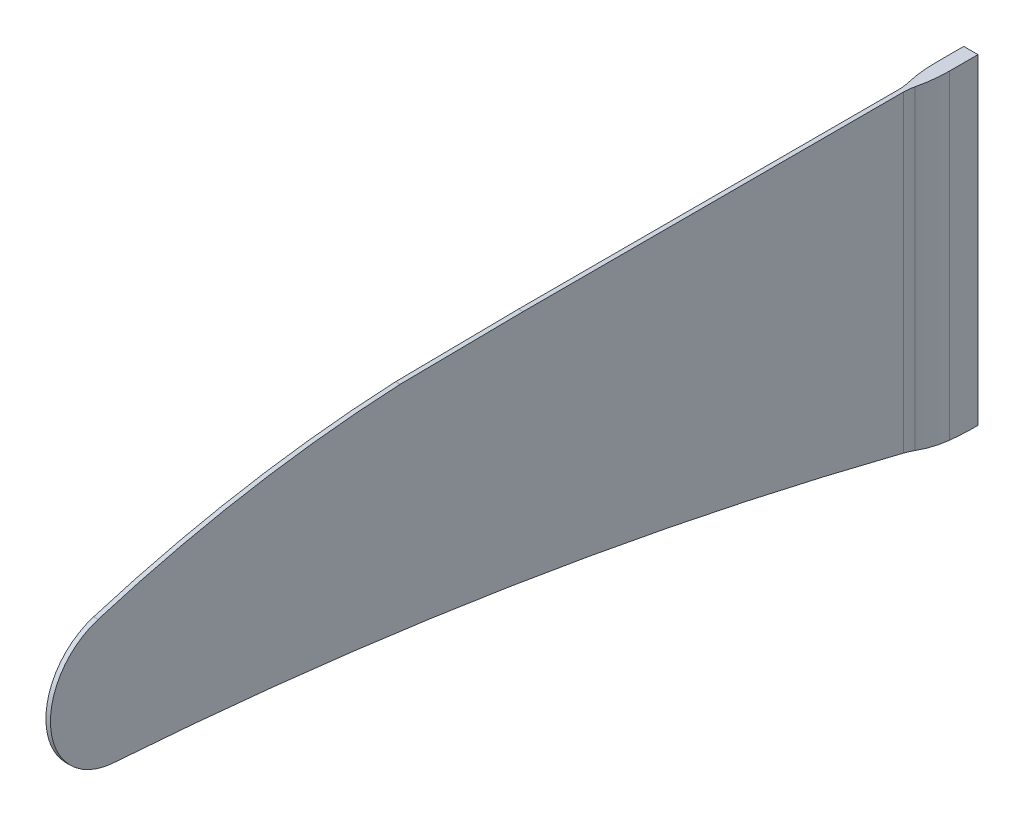
ISO-10303-21;
HEADER;
FILE_DESCRIPTION(('STEP AP214'),'2;1');
FILE_NAME('part.step','',(''),(''),'','','');
FILE_SCHEMA(('AUTOMOTIVE_DESIGN { 1 0 10303 214 1 1 1 1 }'));
ENDSEC;
DATA;
#1=APPLICATION_CONTEXT('core data for automotive mechanical design processes');
#2=APPLICATION_PROTOCOL_DEFINITION('international standard','automotive_design',2000,#1);
#3=PRODUCT_CONTEXT('',#1,'mechanical');
#4=PRODUCT('Part','Part','',(#3));
#5=PRODUCT_RELATED_PRODUCT_CATEGORY('part','',(#4));
#6=PRODUCT_DEFINITION_FORMATION('','',#4);
#7=PRODUCT_DEFINITION_CONTEXT('part definition',#1,'design');
#8=PRODUCT_DEFINITION('design','',#6,#7);
#9=PRODUCT_DEFINITION_SHAPE('','',#8);
#10=(LENGTH_UNIT() NAMED_UNIT(*) SI_UNIT(.MILLI.,.METRE.));
#11=(NAMED_UNIT(*) PLANE_ANGLE_UNIT() SI_UNIT($,.RADIAN.));
#12=(NAMED_UNIT(*) SI_UNIT($,.STERADIAN.) SOLID_ANGLE_UNIT());
#13=UNCERTAINTY_MEASURE_WITH_UNIT(LENGTH_MEASURE(1.E-05),#10,'distance_accuracy_value','');
#14=(GEOMETRIC_REPRESENTATION_CONTEXT(3) GLOBAL_UNCERTAINTY_ASSIGNED_CONTEXT((#13)) GLOBAL_UNIT_ASSIGNED_CONTEXT((#10,
#11,#12)) REPRESENTATION_CONTEXT('',''));
#15=CARTESIAN_POINT('',(0.,0.,0.));
#16=DIRECTION('',(0.,0.,1.));
#17=DIRECTION('',(1.,0.,0.));
#18=AXIS2_PLACEMENT_3D('',#15,#16,#17);
#19=CARTESIAN_POINT('',(-1.57992226031378,72.55,500.));
#20=DIRECTION('',(1.,0.,0.));
#21=DIRECTION('',(0.,1.,0.));
#22=AXIS2_PLACEMENT_3D('',#19,#20,#21);
#23=PLANE('',#22);
#24=CARTESIAN_POINT('',(-1.57992226031378,66.2,0.));
#25=DIRECTION('',(1.,0.,0.));
#26=DIRECTION('',(0.,1.,0.));
#27=AXIS2_PLACEMENT_3D('',#24,#25,#26);
#28=CIRCLE('',#27,65.);
#29=CARTESIAN_POINT('',(-1.57992226031377,1.50489211757772,6.28832378951223));
#30=VERTEX_POINT('',#29);
#31=CARTESIAN_POINT('',(-1.57992226031378,1.19999999999995,0.));
#32=VERTEX_POINT('',#31);
#33=EDGE_CURVE('E260',#30,#32,#28,.T.);
#34=ORIENTED_EDGE('',*,*,#33,.F.);
#35=DIRECTION('',(0.,-1.,0.));
#36=VECTOR('',#35,1.);
#37=CARTESIAN_POINT('',(-1.57992226031378,72.55,6.28832378951222));
#38=LINE('',#37,#36);
#39=CARTESIAN_POINT('',(-1.57992226031378,72.55,6.28832378951222));
#40=VERTEX_POINT('',#39);
#41=EDGE_CURVE('E13',#30,#40,#38,.F.);
#42=ORIENTED_EDGE('',*,*,#41,.T.);
#43=DIRECTION('',(0.,0.,-1.));
#44=VECTOR('',#43,1.);
#45=CARTESIAN_POINT('',(-1.57992226031378,72.55,500.));
#46=LINE('',#45,#44);
#47=CARTESIAN_POINT('',(-1.57992226031378,72.55,0.));
#48=VERTEX_POINT('',#47);
#49=EDGE_CURVE('E365',#40,#48,#46,.T.);
#50=ORIENTED_EDGE('',*,*,#49,.T.);
#51=DIRECTION('',(0.,-1.,0.));
#52=VECTOR('',#51,1.);
#53=CARTESIAN_POINT('',(-1.57992226031378,72.55,0.));
#54=LINE('',#53,#52);
#55=EDGE_CURVE('E264',#48,#32,#54,.T.);
#56=ORIENTED_EDGE('',*,*,#55,.T.);
#57=EDGE_LOOP('',(#34,#42,#50,#56));
#58=FACE_BOUND('',#57,.T.);
#59=ADVANCED_FACE('F105',(#58),#23,.F.);
#60=CARTESIAN_POINT('',(1.57992226031358,1.19999999999996,500.));
#61=DIRECTION('',(-1.,0.,0.));
#62=DIRECTION('',(0.,-1.,0.));
#63=AXIS2_PLACEMENT_3D('',#60,#61,#62);
#64=PLANE('',#63);
#65=DIRECTION('',(0.,0.,-1.));
#66=VECTOR('',#65,1.);
#67=CARTESIAN_POINT('',(1.57992226031357,72.55,500.));
#68=LINE('',#67,#66);
#69=CARTESIAN_POINT('',(1.57992226031357,72.55,6.28832378951311));
#70=VERTEX_POINT('',#69);
#71=CARTESIAN_POINT('',(1.57992226031357,72.55,0.));
#72=VERTEX_POINT('',#71);
#73=EDGE_CURVE('E366',#70,#72,#68,.T.);
#74=ORIENTED_EDGE('',*,*,#73,.F.);
#75=DIRECTION('',(0.,-1.,0.));
#76=VECTOR('',#75,1.);
#77=CARTESIAN_POINT('',(1.57992226031358,1.19999999999996,6.28832378951311));
#78=LINE('',#77,#76);
#79=CARTESIAN_POINT('',(1.57992226031358,1.5048921175778,6.28832378951311));
#80=VERTEX_POINT('',#79);
#81=EDGE_CURVE('E277',#70,#80,#78,.T.);
#82=ORIENTED_EDGE('',*,*,#81,.T.);
#83=CARTESIAN_POINT('',(1.57992226031357,66.2,0.));
#84=DIRECTION('',(-1.,0.,0.));
#85=DIRECTION('',(0.,-1.,0.));
#86=AXIS2_PLACEMENT_3D('',#83,#84,#85);
#87=CIRCLE('',#86,65.);
#88=CARTESIAN_POINT('',(1.57992226031357,1.19999999999995,0.));
#89=VERTEX_POINT('',#88);
#90=EDGE_CURVE('E254',#89,#80,#87,.T.);
#91=ORIENTED_EDGE('',*,*,#90,.F.);
#92=DIRECTION('',(0.,1.,0.));
#93=VECTOR('',#92,1.);
#94=CARTESIAN_POINT('',(1.57992226031358,1.19999999999996,0.));
#95=LINE('',#94,#93);
#96=EDGE_CURVE('E367',#89,#72,#95,.T.);
#97=ORIENTED_EDGE('',*,*,#96,.T.);
#98=EDGE_LOOP('',(#74,#82,#91,#97));
#99=FACE_BOUND('',#98,.T.);
#100=ADVANCED_FACE('F344',(#99),#64,.F.);
#101=CARTESIAN_POINT('',(-1.57993426031378,73.7171966231066,0.867958143014099));
#102=DIRECTION('',(0.,-0.999930691772244,-0.011773344974182));
#103=DIRECTION('',(0.,0.011773344974182,-0.999930691772244));
#104=AXIS2_PLACEMENT_3D('',#101,#102,#103);
#105=PLANE('',#104);
#106=DIRECTION('',(-1.,0.,0.));
#107=VECTOR('',#106,1.);
#108=CARTESIAN_POINT('',(8.42007773968622,72.55,100.));
#109=LINE('',#108,#107);
#110=CARTESIAN_POINT('',(0.499999999999989,72.55,100.));
#111=VERTEX_POINT('',#110);
#112=CARTESIAN_POINT('',(-0.499999999999987,72.55,100.));
#113=VERTEX_POINT('',#112);
#114=EDGE_CURVE('E225',#111,#113,#109,.T.);
#115=ORIENTED_EDGE('',*,*,#114,.T.);
#116=DIRECTION('',(0.,-0.011773344974182,0.999930691772244));
#117=VECTOR('',#116,1.);
#118=CARTESIAN_POINT('',(-0.500000000000001,73.7171966231066,0.867958143014099));
#119=LINE('',#118,#117);
#120=CARTESIAN_POINT('',(-0.499999999999985,72.2283959789141,127.31438957971));
#121=VERTEX_POINT('',#120);
#122=EDGE_CURVE('E228',#113,#121,#119,.T.);
#123=ORIENTED_EDGE('',*,*,#122,.T.);
#124=DIRECTION('',(1.,0.,0.));
#125=VECTOR('',#124,1.);
#126=CARTESIAN_POINT('',(-1.5800452603138,72.2283959789142,127.31438957971));
#127=LINE('',#126,#125);
#128=CARTESIAN_POINT('',(0.499999999999952,72.2283959789142,127.31438957971));
#129=VERTEX_POINT('',#128);
#130=EDGE_CURVE('E371',#129,#121,#127,.F.);
#131=ORIENTED_EDGE('',*,*,#130,.F.);
#132=DIRECTION('',(0.,0.011773344974182,-0.999930691772244));
#133=VECTOR('',#132,1.);
#134=CARTESIAN_POINT('',(0.5,73.7171966231066,0.8679581430141));
#135=LINE('',#134,#133);
#136=EDGE_CURVE('E230',#129,#111,#135,.T.);
#137=ORIENTED_EDGE('',*,*,#136,.T.);
#138=EDGE_LOOP('',(#115,#123,#131,#137));
#139=FACE_BOUND('',#138,.T.);
#140=ADVANCED_FACE('F301',(#139),#105,.F.);
#141=CARTESIAN_POINT('',(0.,0.,0.));
#142=DIRECTION('',(0.,0.,1.));
#143=DIRECTION('',(1.,0.,0.));
#144=AXIS2_PLACEMENT_3D('',#141,#142,#143);
#145=PLANE('',#144);
#146=DIRECTION('',(1.,0.,0.));
#147=VECTOR('',#146,1.);
#148=CARTESIAN_POINT('',(-1.57997726031378,72.55,0.));
#149=LINE('',#148,#147);
#150=EDGE_CURVE('E245',#48,#72,#149,.T.);
#151=ORIENTED_EDGE('',*,*,#150,.T.);
#152=ORIENTED_EDGE('',*,*,#96,.F.);
#153=DIRECTION('',(1.,0.,0.));
#154=VECTOR('',#153,1.);
#155=CARTESIAN_POINT('',(-1.57997726031378,1.19999999999995,0.));
#156=LINE('',#155,#154);
#157=EDGE_CURVE('E244',#32,#89,#156,.T.);
#158=ORIENTED_EDGE('',*,*,#157,.F.);
#159=ORIENTED_EDGE('',*,*,#55,.F.);
#160=EDGE_LOOP('',(#151,#152,#158,#159));
#161=FACE_BOUND('',#160,.T.);
#162=ADVANCED_FACE('F340',(#161),#145,.F.);
#163=CARTESIAN_POINT('',(1.57992226031357,72.55,500.));
#164=DIRECTION('',(0.,-1.,0.));
#165=DIRECTION('',(0.,0.,-1.));
#166=AXIS2_PLACEMENT_3D('',#163,#164,#165);
#167=PLANE('',#166);
#168=CARTESIAN_POINT('',(10.5,72.55,15.5202005616957));
#169=DIRECTION('',(0.,-1.,0.));
#170=DIRECTION('',(0.,0.,-1.));
#171=AXIS2_PLACEMENT_3D('',#168,#169,#170);
#172=CIRCLE('',#171,10.);
#173=CARTESIAN_POINT('',(0.499999999999999,72.55,15.5202005616957));
#174=VERTEX_POINT('',#173);
#175=CARTESIAN_POINT('',(0.769980565078392,72.55,13.2122313686501));
#176=VERTEX_POINT('',#175);
#177=EDGE_CURVE('E200',#174,#176,#172,.T.);
#178=ORIENTED_EDGE('',*,*,#177,.T.);
#179=CARTESIAN_POINT('',(-28.4200777396864,72.55,6.28832378951311));
#180=DIRECTION('',(0.,-1.,0.));
#181=DIRECTION('',(0.,0.,-1.));
#182=AXIS2_PLACEMENT_3D('',#179,#180,#181);
#183=CIRCLE('',#182,30.);
#184=EDGE_CURVE('E359',#176,#70,#183,.F.);
#185=ORIENTED_EDGE('',*,*,#184,.T.);
#186=ORIENTED_EDGE('',*,*,#73,.T.);
#187=ORIENTED_EDGE('',*,*,#150,.F.);
#188=ORIENTED_EDGE('',*,*,#49,.F.);
#189=CARTESIAN_POINT('',(28.4200777396862,72.55,6.28832378951223));
#190=DIRECTION('',(0.,-1.,0.));
#191=DIRECTION('',(0.,0.,-1.));
#192=AXIS2_PLACEMENT_3D('',#189,#190,#191);
#193=CIRCLE('',#192,30.);
#194=CARTESIAN_POINT('',(-0.769980565078444,72.55,13.2122313686499));
#195=VERTEX_POINT('',#194);
#196=EDGE_CURVE('E121',#40,#195,#193,.F.);
#197=ORIENTED_EDGE('',*,*,#196,.T.);
#198=CARTESIAN_POINT('',(-10.5,72.55,15.5202005616957));
#199=DIRECTION('',(0.,-1.,0.));
#200=DIRECTION('',(0.,0.,-1.));
#201=AXIS2_PLACEMENT_3D('',#198,#199,#200);
#202=CIRCLE('',#201,10.);
#203=CARTESIAN_POINT('',(-0.499999999999999,72.55,15.5202005616957));
#204=VERTEX_POINT('',#203);
#205=EDGE_CURVE('E210',#195,#204,#202,.T.);
#206=ORIENTED_EDGE('',*,*,#205,.T.);
#207=DIRECTION('',(0.,0.,1.));
#208=VECTOR('',#207,1.);
#209=CARTESIAN_POINT('',(-0.499999999999938,72.55,500.));
#210=LINE('',#209,#208);
#211=EDGE_CURVE('E236',#204,#113,#210,.T.);
#212=ORIENTED_EDGE('',*,*,#211,.T.);
#213=ORIENTED_EDGE('',*,*,#114,.F.);
#214=DIRECTION('',(0.,0.,-1.));
#215=VECTOR('',#214,1.);
#216=CARTESIAN_POINT('',(0.499999999999938,72.55,500.));
#217=LINE('',#216,#215);
#218=EDGE_CURVE('E215',#111,#174,#217,.T.);
#219=ORIENTED_EDGE('',*,*,#218,.T.);
#220=EDGE_LOOP('',(#178,#185,#186,#187,#188,#197,#206,#212,#213,#219));
#221=FACE_BOUND('',#220,.T.);
#222=ADVANCED_FACE('F222',(#221),#167,.F.);
#223=CARTESIAN_POINT('',(-1.58004526031377,46.1999999999999,190.));
#224=DIRECTION('',(1.,0.,0.));
#225=DIRECTION('',(0.,0.,-1.));
#226=AXIS2_PLACEMENT_3D('',#223,#224,#225);
#227=CYLINDRICAL_SURFACE('',#226,15.);
#228=CARTESIAN_POINT('',(-0.499999999999977,46.1999999999999,190.));
#229=DIRECTION('',(1.,0.,0.));
#230=DIRECTION('',(0.,0.,-1.));
#231=AXIS2_PLACEMENT_3D('',#228,#229,#230);
#232=CIRCLE('',#231,15.);
#233=CARTESIAN_POINT('',(-0.499999999999977,31.2367967574166,191.050023200288));
#234=VERTEX_POINT('',#233);
#235=CARTESIAN_POINT('',(-0.500000000000021,60.5451923076923,194.383543960693));
#236=VERTEX_POINT('',#235);
#237=EDGE_CURVE('E234',#234,#236,#232,.F.);
#238=ORIENTED_EDGE('',*,*,#237,.F.);
#239=DIRECTION('',(1.,0.,0.));
#240=VECTOR('',#239,1.);
#241=CARTESIAN_POINT('',(-1.58004526031377,31.2367967574166,191.050023200288));
#242=LINE('',#241,#240);
#243=CARTESIAN_POINT('',(0.499999999999976,31.2367967574166,191.050023200288));
#244=VERTEX_POINT('',#243);
#245=EDGE_CURVE('E255',#234,#244,#242,.T.);
#246=ORIENTED_EDGE('',*,*,#245,.T.);
#247=CARTESIAN_POINT('',(0.499999999999977,46.1999999999999,190.));
#248=DIRECTION('',(-1.,0.,0.));
#249=DIRECTION('',(0.,0.,1.));
#250=AXIS2_PLACEMENT_3D('',#247,#248,#249);
#251=CIRCLE('',#250,15.);
#252=CARTESIAN_POINT('',(0.499999999999976,60.5451923076923,194.383543960693));
#253=VERTEX_POINT('',#252);
#254=EDGE_CURVE('E390',#253,#244,#251,.F.);
#255=ORIENTED_EDGE('',*,*,#254,.F.);
#256=DIRECTION('',(1.,0.,0.));
#257=VECTOR('',#256,1.);
#258=CARTESIAN_POINT('',(-1.58004526031377,60.5451923076923,194.383543960693));
#259=LINE('',#258,#257);
#260=EDGE_CURVE('E251',#236,#253,#259,.T.);
#261=ORIENTED_EDGE('',*,*,#260,.F.);
#262=EDGE_LOOP('',(#238,#246,#255,#261));
#263=FACE_BOUND('',#262,.T.);
#264=ADVANCED_FACE('F331',(#263),#227,.T.);
#265=CARTESIAN_POINT('',(-1.58004526031377,-966.310086081473,261.051569886161));
#266=DIRECTION('',(1.,0.,0.));
#267=DIRECTION('',(0.,0.,-1.));
#268=AXIS2_PLACEMENT_3D('',#265,#266,#267);
#269=CYLINDRICAL_SURFACE('',#268,1000.);
#270=CARTESIAN_POINT('',(-0.499999999999968,-966.310086081473,261.051569886161));
#271=DIRECTION('',(1.,0.,0.));
#272=DIRECTION('',(0.,0.,-1.));
#273=AXIS2_PLACEMENT_3D('',#270,#271,#272);
#274=CIRCLE('',#273,1000.);
#275=CARTESIAN_POINT('',(-0.499999999999999,3.18295249268008,15.9327249226296));
#276=VERTEX_POINT('',#275);
#277=EDGE_CURVE('E240',#276,#234,#274,.T.);
#278=ORIENTED_EDGE('',*,*,#277,.F.);
#279=DIRECTION('',(1.,0.,0.));
#280=VECTOR('',#279,1.);
#281=CARTESIAN_POINT('',(-1.58004526031377,3.18295249268008,15.9327249226296));
#282=LINE('',#281,#280);
#283=CARTESIAN_POINT('',(0.499999999999999,3.18295249268008,15.9327249226296));
#284=VERTEX_POINT('',#283);
#285=EDGE_CURVE('E248',#276,#284,#282,.T.);
#286=ORIENTED_EDGE('',*,*,#285,.T.);
#287=CARTESIAN_POINT('',(0.499999999999968,-966.310086081473,261.051569886161));
#288=DIRECTION('',(-1.,0.,0.));
#289=DIRECTION('',(0.,0.,1.));
#290=AXIS2_PLACEMENT_3D('',#287,#288,#289);
#291=CIRCLE('',#290,1000.);
#292=EDGE_CURVE('E226',#244,#284,#291,.T.);
#293=ORIENTED_EDGE('',*,*,#292,.F.);
#294=ORIENTED_EDGE('',*,*,#245,.F.);
#295=EDGE_LOOP('',(#278,#286,#293,#294));
#296=FACE_BOUND('',#295,.T.);
#297=ADVANCED_FACE('F298',(#296),#269,.F.);
#298=CARTESIAN_POINT('',(-1.58004526031377,66.2,0.));
#299=DIRECTION('',(1.,0.,0.));
#300=DIRECTION('',(0.,0.,-1.));
#301=AXIS2_PLACEMENT_3D('',#298,#299,#300);
#302=CYLINDRICAL_SURFACE('',#301,65.);
#303=ORIENTED_EDGE('',*,*,#90,.T.);
#304=CARTESIAN_POINT('',(1.57992226031358,1.5048921175778,6.28832378951311));
#305=CARTESIAN_POINT('',(1.579955820108,1.56195870539984,6.87581847035463));
#306=CARTESIAN_POINT('',(1.56266547493592,1.62709912069166,7.4624997395882));
#307=CARTESIAN_POINT('',(1.49410411293245,1.77272853727736,8.6295961738389));
#308=CARTESIAN_POINT('',(1.44296788851709,1.85315575627997,9.21002695052434));
#309=CARTESIAN_POINT('',(1.30737500635404,2.02901756217777,10.3646563176555));
#310=CARTESIAN_POINT('',(1.22291921118261,2.12445176053417,10.9388550690403));
#311=CARTESIAN_POINT('',(1.02105966576886,2.32994893214962,12.0812151188718));
#312=CARTESIAN_POINT('',(0.903526297159662,2.44006854029402,12.6493433507696));
#313=CARTESIAN_POINT('',(0.769980565078394,2.55695684317679,13.2122313686501));
#314=B_SPLINE_CURVE_WITH_KNOTS('',3,(#304,#305,#306,#307,#308,#309,#310,#311,#312,#313),
.UNSPECIFIED.,.F.,.F.,(4,2,2,2,4),(0.,1.77042852175315,3.53384833557092,5.29722250101437,
7.06760524286698),.UNSPECIFIED.);
#315=CARTESIAN_POINT('',(0.769980565078393,2.5569568431768,13.2122313686501));
#316=VERTEX_POINT('',#315);
#317=EDGE_CURVE('E286',#80,#316,#314,.T.);
#318=ORIENTED_EDGE('',*,*,#317,.T.);
#319=CARTESIAN_POINT('',(0.499999999999999,3.08008733747532,15.5202005616957));
#320=CARTESIAN_POINT('',(0.499968696624079,3.0108081845514,15.2385272506194));
#321=CARTESIAN_POINT('',(0.51190002558859,2.94344668579803,14.9563605380322));
#322=CARTESIAN_POINT('',(0.559725351376096,2.81288130621248,14.3929212172539));
#323=CARTESIAN_POINT('',(0.595633686466034,2.74967993800012,14.1116492453024));
#324=CARTESIAN_POINT('',(0.690518461012125,2.62902612971122,13.557664287522));
#325=CARTESIAN_POINT('',(0.74903251434491,2.57148576510136,13.2848912477057));
#326=CARTESIAN_POINT('',(0.888905345430147,2.46104388131463,12.7444670966546));
#327=CARTESIAN_POINT('',(0.970250396487631,2.40813959978528,12.4768130107128));
#328=CARTESIAN_POINT('',(1.13511044664755,2.31815727781069,12.0064262006707));
#329=CARTESIAN_POINT('',(1.21424161999438,2.28015203673724,11.8023226495791));
#330=CARTESIAN_POINT('',(1.38659319670949,2.20676592685611,11.3977516823288));
#331=CARTESIAN_POINT('',(1.47991771774305,2.17140759945188,11.1973245356179));
#332=CARTESIAN_POINT('',(1.57992226031357,2.13753048781218,11.0000000000004));
#333=B_SPLINE_CURVE_WITH_KNOTS('',3,(#319,#320,#321,#322,#323,#324,#325,#326,#327,#328,#329,
#330,#331,#332),.UNSPECIFIED.,.F.,.F.,(4,2,2,2,2,2,4),(0.,0.869986112528973,1.74049294386196,
2.59406388848903,3.44712273542541,4.11319888358215,4.78442049926306),.UNSPECIFIED.);
#334=CARTESIAN_POINT('',(0.499999999999999,3.08008733747532,15.5202005616957));
#335=VERTEX_POINT('',#334);
#336=EDGE_CURVE('E305',#335,#316,#333,.T.);
#337=ORIENTED_EDGE('',*,*,#336,.F.);
#338=CARTESIAN_POINT('',(0.500000000000001,66.2,0.));
#339=DIRECTION('',(-1.,0.,0.));
#340=DIRECTION('',(0.,0.,1.));
#341=AXIS2_PLACEMENT_3D('',#338,#339,#340);
#342=CIRCLE('',#341,65.);
#343=EDGE_CURVE('E218',#284,#335,#342,.F.);
#344=ORIENTED_EDGE('',*,*,#343,.F.);
#345=ORIENTED_EDGE('',*,*,#285,.F.);
#346=CARTESIAN_POINT('',(-0.500000000000001,66.2,0.));
#347=DIRECTION('',(1.,0.,0.));
#348=DIRECTION('',(0.,0.,-1.));
#349=AXIS2_PLACEMENT_3D('',#346,#347,#348);
#350=CIRCLE('',#349,65.);
#351=CARTESIAN_POINT('',(-0.499999999999999,3.08008733747532,15.5202005616957));
#352=VERTEX_POINT('',#351);
#353=EDGE_CURVE('E211',#352,#276,#350,.F.);
#354=ORIENTED_EDGE('',*,*,#353,.F.);
#355=CARTESIAN_POINT('',(-1.57992226031378,2.13753048781211,11.));
#356=CARTESIAN_POINT('',(-1.45026845968053,2.18143208581599,11.2557738230711));
#357=CARTESIAN_POINT('',(-1.33186250178587,2.22784474708297,11.5167991698455));
#358=CARTESIAN_POINT('',(-1.11807278096911,2.32563298800145,12.0472994659038));
#359=CARTESIAN_POINT('',(-1.02269505866946,2.377009864897,12.3167766113105));
#360=CARTESIAN_POINT('',(-0.857157643663026,2.483613359274,12.8567689082294));
#361=CARTESIAN_POINT('',(-0.786549887336367,2.53874738200388,13.1271652977404));
#362=CARTESIAN_POINT('',(-0.668352524846537,2.65350302244342,13.6718727988487));
#363=CARTESIAN_POINT('',(-0.620751591303848,2.71312241504286,13.9461819153891));
#364=CARTESIAN_POINT('',(-0.55653116466148,2.82305957718498,14.4364801541805));
#365=CARTESIAN_POINT('',(-0.535408427168862,2.87255284168283,14.6520772901228));
#366=CARTESIAN_POINT('',(-0.507085344548715,2.97433513961586,15.0852703426332));
#367=CARTESIAN_POINT('',(-0.499992430627914,3.02664261964927,15.3028689608882));
#368=CARTESIAN_POINT('',(-0.499999999999997,3.08008733747532,15.5202005616957));
#369=B_SPLINE_CURVE_WITH_KNOTS('',3,(#355,#356,#357,#358,#359,#360,#361,#362,#363,#364,#365,
#366,#367,#368),.UNSPECIFIED.,.F.,.F.,(4,2,2,2,2,2,4),(0.,0.870003919245588,1.74023580512752,
2.59379808902149,3.44693969344527,4.11313398626268,4.78441010932533),.UNSPECIFIED.);
#370=CARTESIAN_POINT('',(-0.769980565078444,2.55695684317674,13.2122313686499));
#371=VERTEX_POINT('',#370);
#372=EDGE_CURVE('E269',#371,#352,#369,.T.);
#373=ORIENTED_EDGE('',*,*,#372,.F.);
#374=CARTESIAN_POINT('',(-0.769980565078445,2.55695684317674,13.2122313686499));
#375=CARTESIAN_POINT('',(-0.903526297159739,2.44006854029396,12.6493433507694));
#376=CARTESIAN_POINT('',(-1.02105966576896,2.32994893214955,12.0812151188715));
#377=CARTESIAN_POINT('',(-1.22291921118274,2.1244517605341,10.9388550690399));
#378=CARTESIAN_POINT('',(-1.3073750063542,2.0290175621777,10.364656317655));
#379=CARTESIAN_POINT('',(-1.44296788851726,1.85315575627989,9.21002695052375));
#380=CARTESIAN_POINT('',(-1.49410411293263,1.77272853727727,8.62959617383825));
#381=CARTESIAN_POINT('',(-1.56266547493612,1.62709912069157,7.46249973958743));
#382=CARTESIAN_POINT('',(-1.5799558201082,1.56195870539976,6.87581847035381));
#383=CARTESIAN_POINT('',(-1.57992226031378,1.50489211757772,6.28832378951223));
#384=B_SPLINE_CURVE_WITH_KNOTS('',3,(#374,#375,#376,#377,#378,#379,#380,#381,#382,#383),
.UNSPECIFIED.,.F.,.F.,(4,2,2,2,4),(0.,1.77038274185277,3.5337569072964,5.29717672111434,
7.06760524286765),.UNSPECIFIED.);
#385=EDGE_CURVE('E280',#371,#30,#384,.T.);
#386=ORIENTED_EDGE('',*,*,#385,.T.);
#387=ORIENTED_EDGE('',*,*,#33,.T.);
#388=ORIENTED_EDGE('',*,*,#157,.T.);
#389=EDGE_LOOP('',(#303,#318,#337,#344,#345,#354,#373,#386,#387,#388));
#390=FACE_BOUND('',#389,.T.);
#391=ADVANCED_FACE('F292',(#390),#302,.T.);
#392=CARTESIAN_POINT('',(-1.58004526031377,-202.45,114.018571347993));
#393=DIRECTION('',(1.,0.,0.));
#394=DIRECTION('',(0.,0.,-1.));
#395=AXIS2_PLACEMENT_3D('',#392,#393,#394);
#396=CYLINDRICAL_SURFACE('',#395,275.);
#397=CARTESIAN_POINT('',(-0.499999999999986,-202.45,114.018571347993));
#398=DIRECTION('',(1.,0.,0.));
#399=DIRECTION('',(0.,0.,-1.));
#400=AXIS2_PLACEMENT_3D('',#397,#398,#399);
#401=CIRCLE('',#400,275.);
#402=EDGE_CURVE('E313',#236,#121,#401,.F.);
#403=ORIENTED_EDGE('',*,*,#402,.F.);
#404=ORIENTED_EDGE('',*,*,#260,.T.);
#405=CARTESIAN_POINT('',(0.499999999999986,-202.45,114.018571347993));
#406=DIRECTION('',(-1.,0.,0.));
#407=DIRECTION('',(0.,0.,1.));
#408=AXIS2_PLACEMENT_3D('',#405,#406,#407);
#409=CIRCLE('',#408,275.);
#410=EDGE_CURVE('E374',#129,#253,#409,.F.);
#411=ORIENTED_EDGE('',*,*,#410,.F.);
#412=ORIENTED_EDGE('',*,*,#130,.T.);
#413=EDGE_LOOP('',(#403,#404,#411,#412));
#414=FACE_BOUND('',#413,.T.);
#415=ADVANCED_FACE('F297',(#414),#396,.T.);
#416=CARTESIAN_POINT('',(0.499999999999999,72.550055,15.5202005616957));
#417=DIRECTION('',(-1.,0.,0.));
#418=DIRECTION('',(0.,0.,1.));
#419=AXIS2_PLACEMENT_3D('',#416,#417,#418);
#420=PLANE('',#419);
#421=ORIENTED_EDGE('',*,*,#343,.T.);
#422=DIRECTION('',(0.,-1.,0.));
#423=VECTOR('',#422,1.);
#424=CARTESIAN_POINT('',(0.499999999999999,72.550055,15.5202005616957));
#425=LINE('',#424,#423);
#426=EDGE_CURVE('E204',#174,#335,#425,.T.);
#427=ORIENTED_EDGE('',*,*,#426,.F.);
#428=ORIENTED_EDGE('',*,*,#218,.F.);
#429=ORIENTED_EDGE('',*,*,#136,.F.);
#430=ORIENTED_EDGE('',*,*,#410,.T.);
#431=ORIENTED_EDGE('',*,*,#254,.T.);
#432=ORIENTED_EDGE('',*,*,#292,.T.);
#433=EDGE_LOOP('',(#421,#427,#428,#429,#430,#431,#432));
#434=FACE_BOUND('',#433,.T.);
#435=ADVANCED_FACE('F214',(#434),#420,.F.);
#436=CARTESIAN_POINT('',(10.5,72.550055,15.5202005616957));
#437=DIRECTION('',(0.,-1.,0.));
#438=DIRECTION('',(0.,0.,-1.));
#439=AXIS2_PLACEMENT_3D('',#436,#437,#438);
#440=CYLINDRICAL_SURFACE('',#439,10.);
#441=ORIENTED_EDGE('',*,*,#336,.T.);
#442=DIRECTION('',(0.,-1.,0.));
#443=VECTOR('',#442,1.);
#444=CARTESIAN_POINT('',(0.769980565078392,72.550055,13.2122313686501));
#445=LINE('',#444,#443);
#446=EDGE_CURVE('E207',#316,#176,#445,.F.);
#447=ORIENTED_EDGE('',*,*,#446,.T.);
#448=ORIENTED_EDGE('',*,*,#177,.F.);
#449=ORIENTED_EDGE('',*,*,#426,.T.);
#450=EDGE_LOOP('',(#441,#447,#448,#449));
#451=FACE_BOUND('',#450,.T.);
#452=ADVANCED_FACE('F203',(#451),#440,.F.);
#453=CARTESIAN_POINT('',(-10.5,72.550055,15.5202005616957));
#454=DIRECTION('',(0.,-1.,0.));
#455=DIRECTION('',(0.,0.,-1.));
#456=AXIS2_PLACEMENT_3D('',#453,#454,#455);
#457=CYLINDRICAL_SURFACE('',#456,10.);
#458=ORIENTED_EDGE('',*,*,#205,.F.);
#459=DIRECTION('',(0.,-1.,0.));
#460=VECTOR('',#459,1.);
#461=CARTESIAN_POINT('',(-0.769980565078444,72.550055,13.2122313686499));
#462=LINE('',#461,#460);
#463=EDGE_CURVE('E114',#195,#371,#462,.T.);
#464=ORIENTED_EDGE('',*,*,#463,.T.);
#465=ORIENTED_EDGE('',*,*,#372,.T.);
#466=DIRECTION('',(0.,-1.,0.));
#467=VECTOR('',#466,1.);
#468=CARTESIAN_POINT('',(-0.499999999999999,72.550055,15.5202005616957));
#469=LINE('',#468,#467);
#470=EDGE_CURVE('E219',#204,#352,#469,.T.);
#471=ORIENTED_EDGE('',*,*,#470,.F.);
#472=EDGE_LOOP('',(#458,#464,#465,#471));
#473=FACE_BOUND('',#472,.T.);
#474=ADVANCED_FACE('F318',(#473),#457,.F.);
#475=CARTESIAN_POINT('',(-0.499999999999999,72.550055,15.5202005616957));
#476=DIRECTION('',(1.,0.,0.));
#477=DIRECTION('',(0.,0.,-1.));
#478=AXIS2_PLACEMENT_3D('',#475,#476,#477);
#479=PLANE('',#478);
#480=ORIENTED_EDGE('',*,*,#353,.T.);
#481=ORIENTED_EDGE('',*,*,#277,.T.);
#482=ORIENTED_EDGE('',*,*,#237,.T.);
#483=ORIENTED_EDGE('',*,*,#402,.T.);
#484=ORIENTED_EDGE('',*,*,#122,.F.);
#485=ORIENTED_EDGE('',*,*,#211,.F.);
#486=ORIENTED_EDGE('',*,*,#470,.T.);
#487=EDGE_LOOP('',(#480,#481,#482,#483,#484,#485,#486));
#488=FACE_BOUND('',#487,.T.);
#489=ADVANCED_FACE('F321',(#488),#479,.F.);
#490=CARTESIAN_POINT('',(-28.4200777396864,72.550055,6.28832378951311));
#491=DIRECTION('',(0.,-1.,0.));
#492=DIRECTION('',(0.,0.,-1.));
#493=AXIS2_PLACEMENT_3D('',#490,#491,#492);
#494=CYLINDRICAL_SURFACE('',#493,30.);
#495=ORIENTED_EDGE('',*,*,#184,.F.);
#496=ORIENTED_EDGE('',*,*,#446,.F.);
#497=ORIENTED_EDGE('',*,*,#317,.F.);
#498=ORIENTED_EDGE('',*,*,#81,.F.);
#499=EDGE_LOOP('',(#495,#496,#497,#498));
#500=FACE_BOUND('',#499,.T.);
#501=ADVANCED_FACE('F323',(#500),#494,.T.);
#502=CARTESIAN_POINT('',(28.4200777396862,72.550055,6.28832378951223));
#503=DIRECTION('',(0.,-1.,0.));
#504=DIRECTION('',(0.,0.,-1.));
#505=AXIS2_PLACEMENT_3D('',#502,#503,#504);
#506=CYLINDRICAL_SURFACE('',#505,30.);
#507=ORIENTED_EDGE('',*,*,#196,.F.);
#508=ORIENTED_EDGE('',*,*,#41,.F.);
#509=ORIENTED_EDGE('',*,*,#385,.F.);
#510=ORIENTED_EDGE('',*,*,#463,.F.);
#511=EDGE_LOOP('',(#507,#508,#509,#510));
#512=FACE_BOUND('',#511,.T.);
#513=ADVANCED_FACE('F107',(#512),#506,.T.);
#514=CLOSED_SHELL('',(#59,#100,#140,#162,#222,#264,#297,#391,#415,#435,#452,#474,#489,#501,#513));
#515=MANIFOLD_SOLID_BREP('B2',#514);
#516=ADVANCED_BREP_SHAPE_REPRESENTATION('',(#18,#515),#14);
#517=SHAPE_DEFINITION_REPRESENTATION(#9,#516);
ENDSEC;
END-ISO-10303-21;
